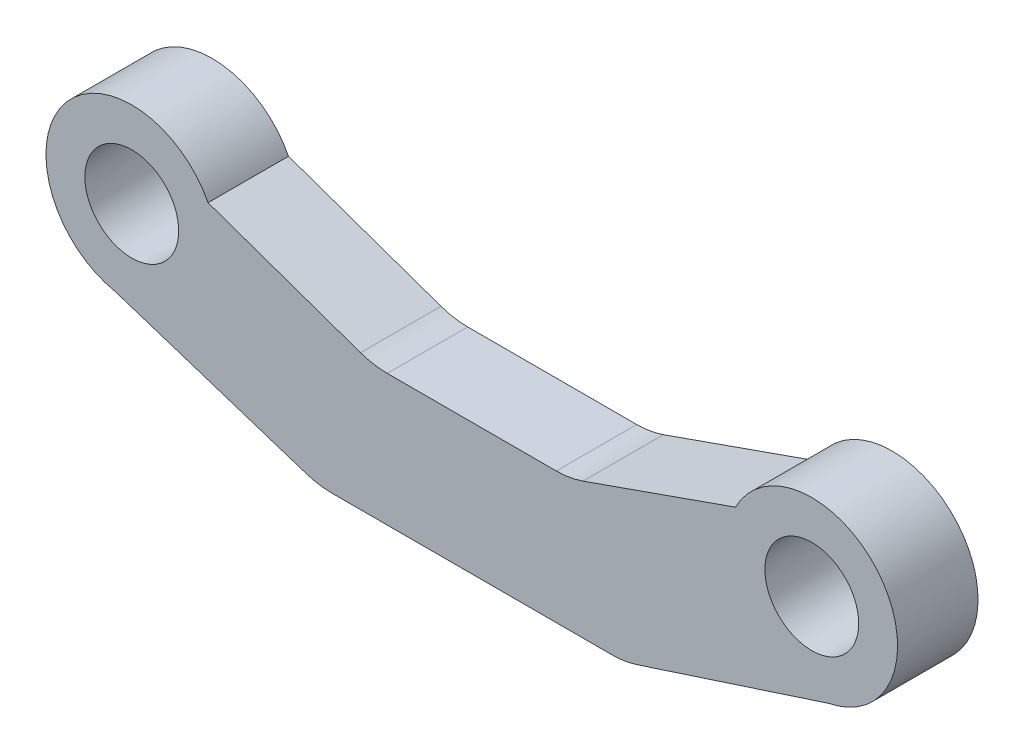
ISO-10303-21;
HEADER;
FILE_DESCRIPTION(('STEP AP214'),'2;1');
FILE_NAME('part.step','',(''),(''),'','','');
FILE_SCHEMA(('AUTOMOTIVE_DESIGN { 1 0 10303 214 1 1 1 1 }'));
ENDSEC;
DATA;
#1=APPLICATION_CONTEXT('core data for automotive mechanical design processes');
#2=APPLICATION_PROTOCOL_DEFINITION('international standard','automotive_design',2000,#1);
#3=PRODUCT_CONTEXT('',#1,'mechanical');
#4=PRODUCT('Part','Part','',(#3));
#5=PRODUCT_RELATED_PRODUCT_CATEGORY('part','',(#4));
#6=PRODUCT_DEFINITION_FORMATION('','',#4);
#7=PRODUCT_DEFINITION_CONTEXT('part definition',#1,'design');
#8=PRODUCT_DEFINITION('design','',#6,#7);
#9=PRODUCT_DEFINITION_SHAPE('','',#8);
#10=(LENGTH_UNIT() NAMED_UNIT(*) SI_UNIT(.MILLI.,.METRE.));
#11=(NAMED_UNIT(*) PLANE_ANGLE_UNIT() SI_UNIT($,.RADIAN.));
#12=(NAMED_UNIT(*) SI_UNIT($,.STERADIAN.) SOLID_ANGLE_UNIT());
#13=UNCERTAINTY_MEASURE_WITH_UNIT(LENGTH_MEASURE(1.E-05),#10,'distance_accuracy_value','');
#14=(GEOMETRIC_REPRESENTATION_CONTEXT(3) GLOBAL_UNCERTAINTY_ASSIGNED_CONTEXT((#13)) GLOBAL_UNIT_ASSIGNED_CONTEXT((#10,
#11,#12)) REPRESENTATION_CONTEXT('',''));
#15=CARTESIAN_POINT('',(0.,0.,0.));
#16=DIRECTION('',(0.,0.,1.));
#17=DIRECTION('',(1.,0.,0.));
#18=AXIS2_PLACEMENT_3D('',#15,#16,#17);
#19=CARTESIAN_POINT('',(6.41938624719755,28.8846796900789,3.));
#20=DIRECTION('',(0.,0.,-1.));
#21=DIRECTION('',(-1.,0.,0.));
#22=AXIS2_PLACEMENT_3D('',#19,#20,#21);
#23=PLANE('',#22);
#24=CARTESIAN_POINT('',(6.41938624719755,28.8846796900789,3.));
#25=DIRECTION('',(0.,0.,1.));
#26=DIRECTION('',(-1.,0.,0.));
#27=AXIS2_PLACEMENT_3D('',#24,#25,#26);
#28=CIRCLE('',#27,3.2);
#29=CARTESIAN_POINT('',(9.26564441233232,30.3471483076579,3.));
#30=VERTEX_POINT('',#29);
#31=CARTESIAN_POINT('',(5.79564441233232,25.7460579984061,3.));
#32=VERTEX_POINT('',#31);
#33=EDGE_CURVE('E200',#30,#32,#28,.T.);
#34=ORIENTED_EDGE('',*,*,#33,.T.);
#35=DIRECTION('',(0.950985081897638,-0.309236760441161,0.));
#36=VECTOR('',#35,1.);
#37=CARTESIAN_POINT('',(12.9434427804246,23.4217712627773,3.));
#38=LINE('',#37,#36);
#39=CARTESIAN_POINT('',(12.9434427804246,23.4217712627773,3.));
#40=VERTEX_POINT('',#39);
#41=EDGE_CURVE('E112',#32,#40,#38,.T.);
#42=ORIENTED_EDGE('',*,*,#41,.T.);
#43=CARTESIAN_POINT('',(13.8711530617481,26.2747265084703,3.));
#44=DIRECTION('',(0.,0.,1.));
#45=DIRECTION('',(1.,0.,0.));
#46=AXIS2_PLACEMENT_3D('',#43,#44,#45);
#47=CIRCLE('',#46,3.);
#48=CARTESIAN_POINT('',(13.8711530617481,23.2747265084703,3.));
#49=VERTEX_POINT('',#48);
#50=EDGE_CURVE('E237',#40,#49,#47,.T.);
#51=ORIENTED_EDGE('',*,*,#50,.T.);
#52=DIRECTION('',(1.,0.,0.));
#53=VECTOR('',#52,1.);
#54=CARTESIAN_POINT('',(13.8711530617481,23.2747265084703,3.));
#55=LINE('',#54,#53);
#56=CARTESIAN_POINT('',(24.3301357629165,23.2747265084703,3.));
#57=VERTEX_POINT('',#56);
#58=EDGE_CURVE('E257',#49,#57,#55,.T.);
#59=ORIENTED_EDGE('',*,*,#58,.T.);
#60=CARTESIAN_POINT('',(24.3301357629165,26.2747265084703,3.));
#61=DIRECTION('',(0.,0.,1.));
#62=DIRECTION('',(1.,0.,0.));
#63=AXIS2_PLACEMENT_3D('',#60,#61,#62);
#64=CIRCLE('',#63,3.);
#65=CARTESIAN_POINT('',(25.25784604424,23.4217712627773,3.));
#66=VERTEX_POINT('',#65);
#67=EDGE_CURVE('E253',#57,#66,#64,.T.);
#68=ORIENTED_EDGE('',*,*,#67,.T.);
#69=DIRECTION('',(0.950985081897637,0.309236760441161,0.));
#70=VECTOR('',#69,1.);
#71=CARTESIAN_POINT('',(25.25784604424,23.4217712627773,3.));
#72=LINE('',#71,#70);
#73=CARTESIAN_POINT('',(32.4056444123323,25.7460579984061,3.));
#74=VERTEX_POINT('',#73);
#75=EDGE_CURVE('E256',#66,#74,#72,.T.);
#76=ORIENTED_EDGE('',*,*,#75,.T.);
#77=CARTESIAN_POINT('',(31.7819025774671,28.8846796900789,3.));
#78=DIRECTION('',(0.,0.,1.));
#79=DIRECTION('',(1.,0.,0.));
#80=AXIS2_PLACEMENT_3D('',#77,#78,#79);
#81=CIRCLE('',#80,3.2);
#82=CARTESIAN_POINT('',(28.9356444123323,30.3471483076579,3.));
#83=VERTEX_POINT('',#82);
#84=EDGE_CURVE('E261',#74,#83,#81,.T.);
#85=ORIENTED_EDGE('',*,*,#84,.T.);
#86=DIRECTION('',(-0.943240770521756,-0.332109693964998,0.));
#87=VECTOR('',#86,1.);
#88=CARTESIAN_POINT('',(23.2492582934097,28.345004196905,3.));
#89=LINE('',#88,#87);
#90=CARTESIAN_POINT('',(23.2492582934097,28.345004196905,3.));
#91=VERTEX_POINT('',#90);
#92=EDGE_CURVE('E268',#83,#91,#89,.T.);
#93=ORIENTED_EDGE('',*,*,#92,.T.);
#94=CARTESIAN_POINT('',(22.2529292115147,31.1747265084703,3.));
#95=DIRECTION('',(0.,0.,-1.));
#96=DIRECTION('',(1.,0.,0.));
#97=AXIS2_PLACEMENT_3D('',#94,#95,#96);
#98=CIRCLE('',#97,3.);
#99=CARTESIAN_POINT('',(22.2529292115147,28.1747265084703,3.));
#100=VERTEX_POINT('',#99);
#101=EDGE_CURVE('E143',#91,#100,#98,.T.);
#102=ORIENTED_EDGE('',*,*,#101,.T.);
#103=DIRECTION('',(-1.,0.,0.));
#104=VECTOR('',#103,1.);
#105=CARTESIAN_POINT('',(15.9483596131499,28.1747265084703,3.));
#106=LINE('',#105,#104);
#107=CARTESIAN_POINT('',(15.9483596131499,28.1747265084703,3.));
#108=VERTEX_POINT('',#107);
#109=EDGE_CURVE('E137',#100,#108,#106,.T.);
#110=ORIENTED_EDGE('',*,*,#109,.T.);
#111=CARTESIAN_POINT('',(15.9483596131499,31.1747265084703,3.));
#112=DIRECTION('',(0.,0.,-1.));
#113=DIRECTION('',(1.,0.,0.));
#114=AXIS2_PLACEMENT_3D('',#111,#112,#113);
#115=CIRCLE('',#114,3.);
#116=CARTESIAN_POINT('',(14.9520305312549,28.345004196905,3.));
#117=VERTEX_POINT('',#116);
#118=EDGE_CURVE('E141',#108,#117,#115,.T.);
#119=ORIENTED_EDGE('',*,*,#118,.T.);
#120=DIRECTION('',(-0.943240770521756,0.332109693964998,0.));
#121=VECTOR('',#120,1.);
#122=CARTESIAN_POINT('',(14.9520305312549,28.345004196905,3.));
#123=LINE('',#122,#121);
#124=EDGE_CURVE('E57',#117,#30,#123,.T.);
#125=ORIENTED_EDGE('',*,*,#124,.T.);
#126=EDGE_LOOP('',(#34,#42,#51,#59,#68,#76,#85,#93,#102,#110,#119,#125));
#127=FACE_BOUND('',#126,.T.);
#128=CARTESIAN_POINT('',(6.41938624719755,28.8846796900789,3.));
#129=DIRECTION('',(0.,0.,1.));
#130=DIRECTION('',(-1.,0.,0.));
#131=AXIS2_PLACEMENT_3D('',#128,#129,#130);
#132=CIRCLE('',#131,1.75);
#133=CARTESIAN_POINT('',(4.66938624719754,28.8846796900789,3.));
#134=VERTEX_POINT('',#133);
#135=EDGE_CURVE('E170',#134,#134,#132,.T.);
#136=ORIENTED_EDGE('',*,*,#135,.F.);
#137=EDGE_LOOP('',(#136));
#138=FACE_BOUND('',#137,.T.);
#139=CARTESIAN_POINT('',(31.7819025774671,28.8846796900789,3.));
#140=DIRECTION('',(0.,0.,1.));
#141=DIRECTION('',(1.,0.,0.));
#142=AXIS2_PLACEMENT_3D('',#139,#140,#141);
#143=CIRCLE('',#142,1.75);
#144=CARTESIAN_POINT('',(33.5319025774671,28.8846796900789,3.));
#145=VERTEX_POINT('',#144);
#146=EDGE_CURVE('E311',#145,#145,#143,.T.);
#147=ORIENTED_EDGE('',*,*,#146,.F.);
#148=EDGE_LOOP('',(#147));
#149=FACE_BOUND('',#148,.T.);
#150=ADVANCED_FACE('F39',(#127,#138,#149),#23,.F.);
#151=CARTESIAN_POINT('',(6.41938624719755,28.8846796900789,0.));
#152=DIRECTION('',(0.,0.,-1.));
#153=DIRECTION('',(-1.,0.,0.));
#154=AXIS2_PLACEMENT_3D('',#151,#152,#153);
#155=PLANE('',#154);
#156=CARTESIAN_POINT('',(6.41938624719755,28.8846796900789,0.));
#157=DIRECTION('',(0.,0.,1.));
#158=DIRECTION('',(-1.,0.,0.));
#159=AXIS2_PLACEMENT_3D('',#156,#157,#158);
#160=CIRCLE('',#159,1.75);
#161=CARTESIAN_POINT('',(4.66938624719754,28.8846796900789,0.));
#162=VERTEX_POINT('',#161);
#163=EDGE_CURVE('E318',#162,#162,#160,.T.);
#164=ORIENTED_EDGE('',*,*,#163,.T.);
#165=EDGE_LOOP('',(#164));
#166=FACE_BOUND('',#165,.T.);
#167=CARTESIAN_POINT('',(6.41938624719755,28.8846796900789,0.));
#168=DIRECTION('',(0.,0.,1.));
#169=DIRECTION('',(-1.,0.,0.));
#170=AXIS2_PLACEMENT_3D('',#167,#168,#169);
#171=CIRCLE('',#170,3.2);
#172=CARTESIAN_POINT('',(9.26564441233232,30.3471483076579,0.));
#173=VERTEX_POINT('',#172);
#174=CARTESIAN_POINT('',(5.79564441233232,25.7460579984061,0.));
#175=VERTEX_POINT('',#174);
#176=EDGE_CURVE('E165',#173,#175,#171,.T.);
#177=ORIENTED_EDGE('',*,*,#176,.F.);
#178=DIRECTION('',(-0.943240770521756,0.332109693964998,0.));
#179=VECTOR('',#178,1.);
#180=CARTESIAN_POINT('',(14.9520305312549,28.345004196905,0.));
#181=LINE('',#180,#179);
#182=CARTESIAN_POINT('',(14.9520305312549,28.345004196905,0.));
#183=VERTEX_POINT('',#182);
#184=EDGE_CURVE('E104',#183,#173,#181,.T.);
#185=ORIENTED_EDGE('',*,*,#184,.F.);
#186=CARTESIAN_POINT('',(15.9483596131499,31.1747265084703,0.));
#187=DIRECTION('',(0.,0.,-1.));
#188=DIRECTION('',(1.,0.,0.));
#189=AXIS2_PLACEMENT_3D('',#186,#187,#188);
#190=CIRCLE('',#189,3.);
#191=CARTESIAN_POINT('',(15.9483596131499,28.1747265084703,0.));
#192=VERTEX_POINT('',#191);
#193=EDGE_CURVE('E98',#192,#183,#190,.T.);
#194=ORIENTED_EDGE('',*,*,#193,.F.);
#195=DIRECTION('',(-1.,0.,0.));
#196=VECTOR('',#195,1.);
#197=CARTESIAN_POINT('',(15.9483596131499,28.1747265084703,0.));
#198=LINE('',#197,#196);
#199=CARTESIAN_POINT('',(22.2529292115147,28.1747265084703,0.));
#200=VERTEX_POINT('',#199);
#201=EDGE_CURVE('E152',#200,#192,#198,.T.);
#202=ORIENTED_EDGE('',*,*,#201,.F.);
#203=CARTESIAN_POINT('',(22.2529292115147,31.1747265084703,0.));
#204=DIRECTION('',(0.,0.,-1.));
#205=DIRECTION('',(1.,0.,0.));
#206=AXIS2_PLACEMENT_3D('',#203,#204,#205);
#207=CIRCLE('',#206,3.);
#208=CARTESIAN_POINT('',(23.2492582934097,28.345004196905,0.));
#209=VERTEX_POINT('',#208);
#210=EDGE_CURVE('E191',#209,#200,#207,.T.);
#211=ORIENTED_EDGE('',*,*,#210,.F.);
#212=DIRECTION('',(-0.943240770521756,-0.332109693964998,0.));
#213=VECTOR('',#212,1.);
#214=CARTESIAN_POINT('',(23.2492582934097,28.345004196905,0.));
#215=LINE('',#214,#213);
#216=CARTESIAN_POINT('',(28.9356444123323,30.3471483076579,0.));
#217=VERTEX_POINT('',#216);
#218=EDGE_CURVE('E188',#217,#209,#215,.T.);
#219=ORIENTED_EDGE('',*,*,#218,.F.);
#220=CARTESIAN_POINT('',(31.7819025774671,28.8846796900789,0.));
#221=DIRECTION('',(0.,0.,1.));
#222=DIRECTION('',(1.,0.,0.));
#223=AXIS2_PLACEMENT_3D('',#220,#221,#222);
#224=CIRCLE('',#223,3.2);
#225=CARTESIAN_POINT('',(32.4056444123323,25.7460579984061,0.));
#226=VERTEX_POINT('',#225);
#227=EDGE_CURVE('E185',#226,#217,#224,.T.);
#228=ORIENTED_EDGE('',*,*,#227,.F.);
#229=DIRECTION('',(0.950985081897637,0.309236760441161,0.));
#230=VECTOR('',#229,1.);
#231=CARTESIAN_POINT('',(25.25784604424,23.4217712627773,0.));
#232=LINE('',#231,#230);
#233=CARTESIAN_POINT('',(25.25784604424,23.4217712627773,0.));
#234=VERTEX_POINT('',#233);
#235=EDGE_CURVE('E182',#234,#226,#232,.T.);
#236=ORIENTED_EDGE('',*,*,#235,.F.);
#237=CARTESIAN_POINT('',(24.3301357629165,26.2747265084703,0.));
#238=DIRECTION('',(0.,0.,1.));
#239=DIRECTION('',(1.,0.,0.));
#240=AXIS2_PLACEMENT_3D('',#237,#238,#239);
#241=CIRCLE('',#240,3.);
#242=CARTESIAN_POINT('',(24.3301357629165,23.2747265084703,0.));
#243=VERTEX_POINT('',#242);
#244=EDGE_CURVE('E179',#243,#234,#241,.T.);
#245=ORIENTED_EDGE('',*,*,#244,.F.);
#246=DIRECTION('',(1.,0.,0.));
#247=VECTOR('',#246,1.);
#248=CARTESIAN_POINT('',(13.8711530617481,23.2747265084703,0.));
#249=LINE('',#248,#247);
#250=CARTESIAN_POINT('',(13.8711530617481,23.2747265084703,0.));
#251=VERTEX_POINT('',#250);
#252=EDGE_CURVE('E176',#251,#243,#249,.T.);
#253=ORIENTED_EDGE('',*,*,#252,.F.);
#254=CARTESIAN_POINT('',(13.8711530617481,26.2747265084703,0.));
#255=DIRECTION('',(0.,0.,1.));
#256=DIRECTION('',(1.,0.,0.));
#257=AXIS2_PLACEMENT_3D('',#254,#255,#256);
#258=CIRCLE('',#257,3.);
#259=CARTESIAN_POINT('',(12.9434427804246,23.4217712627773,0.));
#260=VERTEX_POINT('',#259);
#261=EDGE_CURVE('E173',#260,#251,#258,.T.);
#262=ORIENTED_EDGE('',*,*,#261,.F.);
#263=DIRECTION('',(0.950985081897638,-0.309236760441161,0.));
#264=VECTOR('',#263,1.);
#265=CARTESIAN_POINT('',(12.9434427804246,23.4217712627773,0.));
#266=LINE('',#265,#264);
#267=EDGE_CURVE('E169',#175,#260,#266,.T.);
#268=ORIENTED_EDGE('',*,*,#267,.F.);
#269=EDGE_LOOP('',(#177,#185,#194,#202,#211,#219,#228,#236,#245,#253,#262,#268));
#270=FACE_BOUND('',#269,.T.);
#271=CARTESIAN_POINT('',(31.7819025774671,28.8846796900789,0.));
#272=DIRECTION('',(0.,0.,1.));
#273=DIRECTION('',(1.,0.,0.));
#274=AXIS2_PLACEMENT_3D('',#271,#272,#273);
#275=CIRCLE('',#274,1.75);
#276=CARTESIAN_POINT('',(33.5319025774671,28.8846796900789,0.));
#277=VERTEX_POINT('',#276);
#278=EDGE_CURVE('E314',#277,#277,#275,.T.);
#279=ORIENTED_EDGE('',*,*,#278,.T.);
#280=EDGE_LOOP('',(#279));
#281=FACE_BOUND('',#280,.T.);
#282=ADVANCED_FACE('F241',(#166,#270,#281),#155,.T.);
#283=CARTESIAN_POINT('',(6.41938624719755,28.8846796900789,3.));
#284=DIRECTION('',(0.,0.,-1.));
#285=DIRECTION('',(-1.,0.,0.));
#286=AXIS2_PLACEMENT_3D('',#283,#284,#285);
#287=CYLINDRICAL_SURFACE('',#286,3.2);
#288=ORIENTED_EDGE('',*,*,#176,.T.);
#289=DIRECTION('',(0.,0.,-1.));
#290=VECTOR('',#289,1.);
#291=CARTESIAN_POINT('',(5.79564441233232,25.7460579984061,3.));
#292=LINE('',#291,#290);
#293=EDGE_CURVE('E11',#32,#175,#292,.T.);
#294=ORIENTED_EDGE('',*,*,#293,.F.);
#295=ORIENTED_EDGE('',*,*,#33,.F.);
#296=DIRECTION('',(0.,0.,-1.));
#297=VECTOR('',#296,1.);
#298=CARTESIAN_POINT('',(9.26564441233232,30.3471483076579,3.));
#299=LINE('',#298,#297);
#300=EDGE_CURVE('E161',#30,#173,#299,.T.);
#301=ORIENTED_EDGE('',*,*,#300,.T.);
#302=EDGE_LOOP('',(#288,#294,#295,#301));
#303=FACE_BOUND('',#302,.T.);
#304=ADVANCED_FACE('F41',(#303),#287,.T.);
#305=CARTESIAN_POINT('',(12.9434427804246,23.4217712627773,3.));
#306=DIRECTION('',(0.309236760441161,0.950985081897637,0.));
#307=DIRECTION('',(-0.950985081897638,0.309236760441161,0.));
#308=AXIS2_PLACEMENT_3D('',#305,#306,#307);
#309=PLANE('',#308);
#310=ORIENTED_EDGE('',*,*,#267,.T.);
#311=DIRECTION('',(0.,0.,-1.));
#312=VECTOR('',#311,1.);
#313=CARTESIAN_POINT('',(12.9434427804246,23.4217712627773,3.));
#314=LINE('',#313,#312);
#315=EDGE_CURVE('E49',#40,#260,#314,.T.);
#316=ORIENTED_EDGE('',*,*,#315,.F.);
#317=ORIENTED_EDGE('',*,*,#41,.F.);
#318=ORIENTED_EDGE('',*,*,#293,.T.);
#319=EDGE_LOOP('',(#310,#316,#317,#318));
#320=FACE_BOUND('',#319,.T.);
#321=ADVANCED_FACE('F418',(#320),#309,.F.);
#322=CARTESIAN_POINT('',(13.8711530617481,26.2747265084703,3.));
#323=DIRECTION('',(0.,0.,-1.));
#324=DIRECTION('',(-1.,0.,0.));
#325=AXIS2_PLACEMENT_3D('',#322,#323,#324);
#326=CYLINDRICAL_SURFACE('',#325,3.);
#327=ORIENTED_EDGE('',*,*,#261,.T.);
#328=DIRECTION('',(0.,0.,-1.));
#329=VECTOR('',#328,1.);
#330=CARTESIAN_POINT('',(13.8711530617481,23.2747265084703,3.));
#331=LINE('',#330,#329);
#332=EDGE_CURVE('E227',#49,#251,#331,.T.);
#333=ORIENTED_EDGE('',*,*,#332,.F.);
#334=ORIENTED_EDGE('',*,*,#50,.F.);
#335=ORIENTED_EDGE('',*,*,#315,.T.);
#336=EDGE_LOOP('',(#327,#333,#334,#335));
#337=FACE_BOUND('',#336,.T.);
#338=ADVANCED_FACE('F235',(#337),#326,.T.);
#339=CARTESIAN_POINT('',(13.8711530617481,23.2747265084703,3.));
#340=DIRECTION('',(0.,1.,0.));
#341=DIRECTION('',(0.,0.,1.));
#342=AXIS2_PLACEMENT_3D('',#339,#340,#341);
#343=PLANE('',#342);
#344=ORIENTED_EDGE('',*,*,#252,.T.);
#345=DIRECTION('',(0.,0.,-1.));
#346=VECTOR('',#345,1.);
#347=CARTESIAN_POINT('',(24.3301357629165,23.2747265084703,3.));
#348=LINE('',#347,#346);
#349=EDGE_CURVE('E223',#57,#243,#348,.T.);
#350=ORIENTED_EDGE('',*,*,#349,.F.);
#351=ORIENTED_EDGE('',*,*,#58,.F.);
#352=ORIENTED_EDGE('',*,*,#332,.T.);
#353=EDGE_LOOP('',(#344,#350,#351,#352));
#354=FACE_BOUND('',#353,.T.);
#355=ADVANCED_FACE('F247',(#354),#343,.F.);
#356=CARTESIAN_POINT('',(24.3301357629165,26.2747265084703,3.));
#357=DIRECTION('',(0.,0.,-1.));
#358=DIRECTION('',(-1.,0.,0.));
#359=AXIS2_PLACEMENT_3D('',#356,#357,#358);
#360=CYLINDRICAL_SURFACE('',#359,3.);
#361=ORIENTED_EDGE('',*,*,#244,.T.);
#362=DIRECTION('',(0.,0.,-1.));
#363=VECTOR('',#362,1.);
#364=CARTESIAN_POINT('',(25.25784604424,23.4217712627773,3.));
#365=LINE('',#364,#363);
#366=EDGE_CURVE('E219',#66,#234,#365,.T.);
#367=ORIENTED_EDGE('',*,*,#366,.F.);
#368=ORIENTED_EDGE('',*,*,#67,.F.);
#369=ORIENTED_EDGE('',*,*,#349,.T.);
#370=EDGE_LOOP('',(#361,#367,#368,#369));
#371=FACE_BOUND('',#370,.T.);
#372=ADVANCED_FACE('F251',(#371),#360,.T.);
#373=CARTESIAN_POINT('',(25.25784604424,23.4217712627773,3.));
#374=DIRECTION('',(-0.309236760441161,0.950985081897637,0.));
#375=DIRECTION('',(-0.950985081897638,-0.309236760441161,0.));
#376=AXIS2_PLACEMENT_3D('',#373,#374,#375);
#377=PLANE('',#376);
#378=ORIENTED_EDGE('',*,*,#235,.T.);
#379=DIRECTION('',(0.,0.,-1.));
#380=VECTOR('',#379,1.);
#381=CARTESIAN_POINT('',(32.4056444123323,25.7460579984061,3.));
#382=LINE('',#381,#380);
#383=EDGE_CURVE('E215',#74,#226,#382,.T.);
#384=ORIENTED_EDGE('',*,*,#383,.F.);
#385=ORIENTED_EDGE('',*,*,#75,.F.);
#386=ORIENTED_EDGE('',*,*,#366,.T.);
#387=EDGE_LOOP('',(#378,#384,#385,#386));
#388=FACE_BOUND('',#387,.T.);
#389=ADVANCED_FACE('F383',(#388),#377,.F.);
#390=CARTESIAN_POINT('',(31.7819025774671,28.8846796900789,3.));
#391=DIRECTION('',(0.,0.,-1.));
#392=DIRECTION('',(-1.,0.,0.));
#393=AXIS2_PLACEMENT_3D('',#390,#391,#392);
#394=CYLINDRICAL_SURFACE('',#393,3.2);
#395=ORIENTED_EDGE('',*,*,#227,.T.);
#396=DIRECTION('',(0.,0.,-1.));
#397=VECTOR('',#396,1.);
#398=CARTESIAN_POINT('',(28.9356444123323,30.3471483076579,3.));
#399=LINE('',#398,#397);
#400=EDGE_CURVE('E211',#83,#217,#399,.T.);
#401=ORIENTED_EDGE('',*,*,#400,.F.);
#402=ORIENTED_EDGE('',*,*,#84,.F.);
#403=ORIENTED_EDGE('',*,*,#383,.T.);
#404=EDGE_LOOP('',(#395,#401,#402,#403));
#405=FACE_BOUND('',#404,.T.);
#406=ADVANCED_FACE('F374',(#405),#394,.T.);
#407=CARTESIAN_POINT('',(23.2492582934097,28.345004196905,3.));
#408=DIRECTION('',(0.332109693964998,-0.943240770521756,0.));
#409=DIRECTION('',(0.943240770521756,0.332109693964998,0.));
#410=AXIS2_PLACEMENT_3D('',#407,#408,#409);
#411=PLANE('',#410);
#412=ORIENTED_EDGE('',*,*,#218,.T.);
#413=DIRECTION('',(0.,0.,-1.));
#414=VECTOR('',#413,1.);
#415=CARTESIAN_POINT('',(23.2492582934097,28.345004196905,3.));
#416=LINE('',#415,#414);
#417=EDGE_CURVE('E207',#91,#209,#416,.T.);
#418=ORIENTED_EDGE('',*,*,#417,.F.);
#419=ORIENTED_EDGE('',*,*,#92,.F.);
#420=ORIENTED_EDGE('',*,*,#400,.T.);
#421=EDGE_LOOP('',(#412,#418,#419,#420));
#422=FACE_BOUND('',#421,.T.);
#423=ADVANCED_FACE('F276',(#422),#411,.F.);
#424=CARTESIAN_POINT('',(22.2529292115147,31.1747265084703,3.));
#425=DIRECTION('',(0.,0.,-1.));
#426=DIRECTION('',(-1.,0.,0.));
#427=AXIS2_PLACEMENT_3D('',#424,#425,#426);
#428=CYLINDRICAL_SURFACE('',#427,3.);
#429=ORIENTED_EDGE('',*,*,#210,.T.);
#430=DIRECTION('',(0.,0.,-1.));
#431=VECTOR('',#430,1.);
#432=CARTESIAN_POINT('',(22.2529292115147,28.1747265084703,3.));
#433=LINE('',#432,#431);
#434=EDGE_CURVE('E154',#100,#200,#433,.T.);
#435=ORIENTED_EDGE('',*,*,#434,.F.);
#436=ORIENTED_EDGE('',*,*,#101,.F.);
#437=ORIENTED_EDGE('',*,*,#417,.T.);
#438=EDGE_LOOP('',(#429,#435,#436,#437));
#439=FACE_BOUND('',#438,.T.);
#440=ADVANCED_FACE('F280',(#439),#428,.F.);
#441=CARTESIAN_POINT('',(15.9483596131499,28.1747265084703,3.));
#442=DIRECTION('',(0.,-1.,0.));
#443=DIRECTION('',(0.,0.,-1.));
#444=AXIS2_PLACEMENT_3D('',#441,#442,#443);
#445=PLANE('',#444);
#446=ORIENTED_EDGE('',*,*,#201,.T.);
#447=DIRECTION('',(0.,0.,-1.));
#448=VECTOR('',#447,1.);
#449=CARTESIAN_POINT('',(15.9483596131499,28.1747265084703,3.));
#450=LINE('',#449,#448);
#451=EDGE_CURVE('E149',#108,#192,#450,.T.);
#452=ORIENTED_EDGE('',*,*,#451,.F.);
#453=ORIENTED_EDGE('',*,*,#109,.F.);
#454=ORIENTED_EDGE('',*,*,#434,.T.);
#455=EDGE_LOOP('',(#446,#452,#453,#454));
#456=FACE_BOUND('',#455,.T.);
#457=ADVANCED_FACE('F150',(#456),#445,.F.);
#458=CARTESIAN_POINT('',(15.9483596131499,31.1747265084703,3.));
#459=DIRECTION('',(0.,0.,-1.));
#460=DIRECTION('',(-1.,0.,0.));
#461=AXIS2_PLACEMENT_3D('',#458,#459,#460);
#462=CYLINDRICAL_SURFACE('',#461,3.);
#463=ORIENTED_EDGE('',*,*,#193,.T.);
#464=DIRECTION('',(0.,0.,-1.));
#465=VECTOR('',#464,1.);
#466=CARTESIAN_POINT('',(14.9520305312549,28.345004196905,3.));
#467=LINE('',#466,#465);
#468=EDGE_CURVE('E155',#117,#183,#467,.T.);
#469=ORIENTED_EDGE('',*,*,#468,.F.);
#470=ORIENTED_EDGE('',*,*,#118,.F.);
#471=ORIENTED_EDGE('',*,*,#451,.T.);
#472=EDGE_LOOP('',(#463,#469,#470,#471));
#473=FACE_BOUND('',#472,.T.);
#474=ADVANCED_FACE('F157',(#473),#462,.F.);
#475=CARTESIAN_POINT('',(14.9520305312549,28.345004196905,3.));
#476=DIRECTION('',(-0.332109693964998,-0.943240770521756,0.));
#477=DIRECTION('',(0.943240770521756,-0.332109693964998,0.));
#478=AXIS2_PLACEMENT_3D('',#475,#476,#477);
#479=PLANE('',#478);
#480=ORIENTED_EDGE('',*,*,#184,.T.);
#481=ORIENTED_EDGE('',*,*,#300,.F.);
#482=ORIENTED_EDGE('',*,*,#124,.F.);
#483=ORIENTED_EDGE('',*,*,#468,.T.);
#484=EDGE_LOOP('',(#480,#481,#482,#483));
#485=FACE_BOUND('',#484,.T.);
#486=ADVANCED_FACE('F284',(#485),#479,.F.);
#487=CARTESIAN_POINT('',(6.41938624719755,28.8846796900789,3.));
#488=DIRECTION('',(0.,0.,-1.));
#489=DIRECTION('',(-1.,0.,0.));
#490=AXIS2_PLACEMENT_3D('',#487,#488,#489);
#491=CYLINDRICAL_SURFACE('',#490,1.75);
#492=ORIENTED_EDGE('',*,*,#135,.T.);
#493=EDGE_LOOP('',(#492));
#494=FACE_BOUND('',#493,.T.);
#495=ORIENTED_EDGE('',*,*,#163,.F.);
#496=EDGE_LOOP('',(#495));
#497=FACE_BOUND('',#496,.T.);
#498=ADVANCED_FACE('F286',(#494,#497),#491,.F.);
#499=CARTESIAN_POINT('',(31.7819025774671,28.8846796900789,3.));
#500=DIRECTION('',(0.,0.,-1.));
#501=DIRECTION('',(-1.,0.,0.));
#502=AXIS2_PLACEMENT_3D('',#499,#500,#501);
#503=CYLINDRICAL_SURFACE('',#502,1.75);
#504=ORIENTED_EDGE('',*,*,#146,.T.);
#505=EDGE_LOOP('',(#504));
#506=FACE_BOUND('',#505,.T.);
#507=ORIENTED_EDGE('',*,*,#278,.F.);
#508=EDGE_LOOP('',(#507));
#509=FACE_BOUND('',#508,.T.);
#510=ADVANCED_FACE('F292',(#506,#509),#503,.F.);
#511=CLOSED_SHELL('',(#150,#282,#304,#321,#338,#355,#372,#389,#406,#423,#440,#457,#474,#486,
#498,#510));
#512=MANIFOLD_SOLID_BREP('B2',#511);
#513=ADVANCED_BREP_SHAPE_REPRESENTATION('',(#18,#512),#14);
#514=SHAPE_DEFINITION_REPRESENTATION(#9,#513);
ENDSEC;
END-ISO-10303-21;
